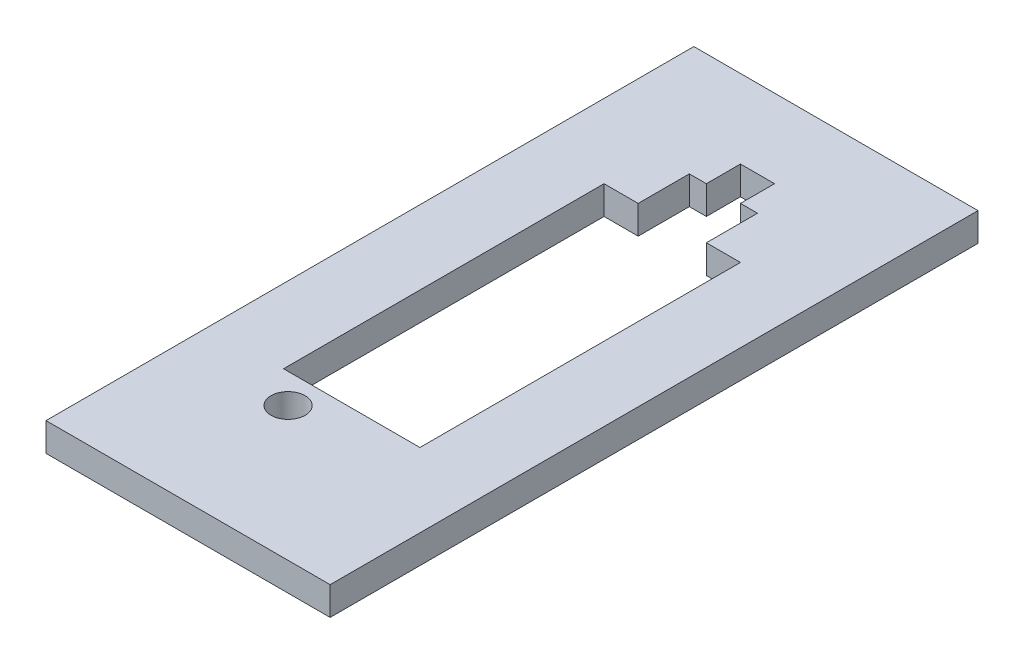
ISO-10303-21;
HEADER;
FILE_DESCRIPTION(('STEP AP214'),'2;1');
FILE_NAME('part.step','',(''),(''),'','','');
FILE_SCHEMA(('AUTOMOTIVE_DESIGN { 1 0 10303 214 1 1 1 1 }'));
ENDSEC;
DATA;
#1=APPLICATION_CONTEXT('core data for automotive mechanical design processes');
#2=APPLICATION_PROTOCOL_DEFINITION('international standard','automotive_design',2000,#1);
#3=PRODUCT_CONTEXT('',#1,'mechanical');
#4=PRODUCT('Part','Part','',(#3));
#5=PRODUCT_RELATED_PRODUCT_CATEGORY('part','',(#4));
#6=PRODUCT_DEFINITION_FORMATION('','',#4);
#7=PRODUCT_DEFINITION_CONTEXT('part definition',#1,'design');
#8=PRODUCT_DEFINITION('design','',#6,#7);
#9=PRODUCT_DEFINITION_SHAPE('','',#8);
#10=(LENGTH_UNIT() NAMED_UNIT(*) SI_UNIT(.MILLI.,.METRE.));
#11=(NAMED_UNIT(*) PLANE_ANGLE_UNIT() SI_UNIT($,.RADIAN.));
#12=(NAMED_UNIT(*) SI_UNIT($,.STERADIAN.) SOLID_ANGLE_UNIT());
#13=UNCERTAINTY_MEASURE_WITH_UNIT(LENGTH_MEASURE(1.E-05),#10,'distance_accuracy_value','');
#14=(GEOMETRIC_REPRESENTATION_CONTEXT(3) GLOBAL_UNCERTAINTY_ASSIGNED_CONTEXT((#13)) GLOBAL_UNIT_ASSIGNED_CONTEXT((#10,
#11,#12)) REPRESENTATION_CONTEXT('',''));
#15=CARTESIAN_POINT('',(0.,0.,0.));
#16=DIRECTION('',(0.,0.,1.));
#17=DIRECTION('',(1.,0.,0.));
#18=AXIS2_PLACEMENT_3D('',#15,#16,#17);
#19=CARTESIAN_POINT('',(-7.62,-38.9217188212443,-17.907));
#20=DIRECTION('',(0.,0.,-1.));
#21=DIRECTION('',(-1.,0.,0.));
#22=AXIS2_PLACEMENT_3D('',#19,#20,#21);
#23=PLANE('',#22);
#24=DIRECTION('',(0.,1.,0.));
#25=VECTOR('',#24,1.);
#26=CARTESIAN_POINT('',(3.81,-12.1979516723096,-17.907));
#27=LINE('',#26,#25);
#28=CARTESIAN_POINT('',(3.81,0.,-17.907));
#29=VERTEX_POINT('',#28);
#30=CARTESIAN_POINT('',(3.81,3.175,-17.907));
#31=VERTEX_POINT('',#30);
#32=EDGE_CURVE('E161',#29,#31,#27,.T.);
#33=ORIENTED_EDGE('',*,*,#32,.F.);
#34=DIRECTION('',(1.,0.,0.));
#35=VECTOR('',#34,1.);
#36=CARTESIAN_POINT('',(-7.62,0.,-17.907));
#37=LINE('',#36,#35);
#38=CARTESIAN_POINT('',(7.62,0.,-17.907));
#39=VERTEX_POINT('',#38);
#40=EDGE_CURVE('E216',#29,#39,#37,.T.);
#41=ORIENTED_EDGE('',*,*,#40,.T.);
#42=DIRECTION('',(0.,1.,0.));
#43=VECTOR('',#42,1.);
#44=CARTESIAN_POINT('',(7.62,-38.9217188212443,-17.907));
#45=LINE('',#44,#43);
#46=CARTESIAN_POINT('',(7.62,3.175,-17.907));
#47=VERTEX_POINT('',#46);
#48=EDGE_CURVE('E227',#39,#47,#45,.T.);
#49=ORIENTED_EDGE('',*,*,#48,.T.);
#50=DIRECTION('',(-1.,0.,0.));
#51=VECTOR('',#50,1.);
#52=CARTESIAN_POINT('',(-7.62,3.175,-17.907));
#53=LINE('',#52,#51);
#54=EDGE_CURVE('E219',#47,#31,#53,.T.);
#55=ORIENTED_EDGE('',*,*,#54,.T.);
#56=EDGE_LOOP('',(#33,#41,#49,#55));
#57=FACE_BOUND('',#56,.T.);
#58=ADVANCED_FACE('F32',(#57),#23,.F.);
#59=CARTESIAN_POINT('',(15.875,3.175,-36.195));
#60=DIRECTION('',(-1.,0.,0.));
#61=DIRECTION('',(0.,0.,1.));
#62=AXIS2_PLACEMENT_3D('',#59,#60,#61);
#63=PLANE('',#62);
#64=DIRECTION('',(0.,0.,-1.));
#65=VECTOR('',#64,1.);
#66=CARTESIAN_POINT('',(15.875,0.,-36.195));
#67=LINE('',#66,#65);
#68=CARTESIAN_POINT('',(15.875,0.,36.195));
#69=VERTEX_POINT('',#68);
#70=CARTESIAN_POINT('',(15.875,0.,-36.195));
#71=VERTEX_POINT('',#70);
#72=EDGE_CURVE('E238',#69,#71,#67,.T.);
#73=ORIENTED_EDGE('',*,*,#72,.T.);
#74=DIRECTION('',(0.,-1.,0.));
#75=VECTOR('',#74,1.);
#76=CARTESIAN_POINT('',(15.875,3.175,-36.195));
#77=LINE('',#76,#75);
#78=CARTESIAN_POINT('',(15.875,3.175,-36.195));
#79=VERTEX_POINT('',#78);
#80=EDGE_CURVE('E11',#79,#71,#77,.T.);
#81=ORIENTED_EDGE('',*,*,#80,.F.);
#82=DIRECTION('',(0.,0.,-1.));
#83=VECTOR('',#82,1.);
#84=CARTESIAN_POINT('',(15.875,3.175,-36.195));
#85=LINE('',#84,#83);
#86=CARTESIAN_POINT('',(15.875,3.175,36.195));
#87=VERTEX_POINT('',#86);
#88=EDGE_CURVE('E239',#87,#79,#85,.T.);
#89=ORIENTED_EDGE('',*,*,#88,.F.);
#90=DIRECTION('',(0.,-1.,0.));
#91=VECTOR('',#90,1.);
#92=CARTESIAN_POINT('',(15.875,3.175,36.195));
#93=LINE('',#92,#91);
#94=EDGE_CURVE('E249',#87,#69,#93,.T.);
#95=ORIENTED_EDGE('',*,*,#94,.T.);
#96=EDGE_LOOP('',(#73,#81,#89,#95));
#97=FACE_BOUND('',#96,.T.);
#98=ADVANCED_FACE('F34',(#97),#63,.F.);
#99=CARTESIAN_POINT('',(-15.875,3.175,-36.195));
#100=DIRECTION('',(0.,0.,1.));
#101=DIRECTION('',(1.,0.,0.));
#102=AXIS2_PLACEMENT_3D('',#99,#100,#101);
#103=PLANE('',#102);
#104=DIRECTION('',(-1.,0.,0.));
#105=VECTOR('',#104,1.);
#106=CARTESIAN_POINT('',(-15.875,0.,-36.195));
#107=LINE('',#106,#105);
#108=CARTESIAN_POINT('',(-15.875,0.,-36.195));
#109=VERTEX_POINT('',#108);
#110=EDGE_CURVE('E252',#71,#109,#107,.T.);
#111=ORIENTED_EDGE('',*,*,#110,.T.);
#112=DIRECTION('',(0.,-1.,0.));
#113=VECTOR('',#112,1.);
#114=CARTESIAN_POINT('',(-15.875,3.175,-36.195));
#115=LINE('',#114,#113);
#116=CARTESIAN_POINT('',(-15.875,3.175,-36.195));
#117=VERTEX_POINT('',#116);
#118=EDGE_CURVE('E40',#117,#109,#115,.T.);
#119=ORIENTED_EDGE('',*,*,#118,.F.);
#120=DIRECTION('',(-1.,0.,0.));
#121=VECTOR('',#120,1.);
#122=CARTESIAN_POINT('',(-15.875,3.175,-36.195));
#123=LINE('',#122,#121);
#124=EDGE_CURVE('E242',#79,#117,#123,.T.);
#125=ORIENTED_EDGE('',*,*,#124,.F.);
#126=ORIENTED_EDGE('',*,*,#80,.T.);
#127=EDGE_LOOP('',(#111,#119,#125,#126));
#128=FACE_BOUND('',#127,.T.);
#129=ADVANCED_FACE('F281',(#128),#103,.F.);
#130=CARTESIAN_POINT('',(-15.875,3.175,-36.195));
#131=DIRECTION('',(1.,0.,0.));
#132=DIRECTION('',(0.,0.,-1.));
#133=AXIS2_PLACEMENT_3D('',#130,#131,#132);
#134=PLANE('',#133);
#135=DIRECTION('',(0.,0.,1.));
#136=VECTOR('',#135,1.);
#137=CARTESIAN_POINT('',(-15.875,0.,-36.195));
#138=LINE('',#137,#136);
#139=CARTESIAN_POINT('',(-15.875,0.,36.195));
#140=VERTEX_POINT('',#139);
#141=EDGE_CURVE('E254',#109,#140,#138,.T.);
#142=ORIENTED_EDGE('',*,*,#141,.T.);
#143=DIRECTION('',(0.,-1.,0.));
#144=VECTOR('',#143,1.);
#145=CARTESIAN_POINT('',(-15.875,3.175,36.195));
#146=LINE('',#145,#144);
#147=CARTESIAN_POINT('',(-15.875,3.175,36.195));
#148=VERTEX_POINT('',#147);
#149=EDGE_CURVE('E259',#148,#140,#146,.T.);
#150=ORIENTED_EDGE('',*,*,#149,.F.);
#151=DIRECTION('',(0.,0.,1.));
#152=VECTOR('',#151,1.);
#153=CARTESIAN_POINT('',(-15.875,3.175,-36.195));
#154=LINE('',#153,#152);
#155=EDGE_CURVE('E245',#117,#148,#154,.T.);
#156=ORIENTED_EDGE('',*,*,#155,.F.);
#157=ORIENTED_EDGE('',*,*,#118,.T.);
#158=EDGE_LOOP('',(#142,#150,#156,#157));
#159=FACE_BOUND('',#158,.T.);
#160=ADVANCED_FACE('F266',(#159),#134,.F.);
#161=CARTESIAN_POINT('',(-15.875,3.175,36.195));
#162=DIRECTION('',(0.,0.,-1.));
#163=DIRECTION('',(-1.,0.,0.));
#164=AXIS2_PLACEMENT_3D('',#161,#162,#163);
#165=PLANE('',#164);
#166=DIRECTION('',(1.,0.,0.));
#167=VECTOR('',#166,1.);
#168=CARTESIAN_POINT('',(-15.875,0.,36.195));
#169=LINE('',#168,#167);
#170=EDGE_CURVE('E243',#140,#69,#169,.T.);
#171=ORIENTED_EDGE('',*,*,#170,.T.);
#172=ORIENTED_EDGE('',*,*,#94,.F.);
#173=DIRECTION('',(1.,0.,0.));
#174=VECTOR('',#173,1.);
#175=CARTESIAN_POINT('',(-15.875,3.175,36.195));
#176=LINE('',#175,#174);
#177=EDGE_CURVE('E247',#148,#87,#176,.T.);
#178=ORIENTED_EDGE('',*,*,#177,.F.);
#179=ORIENTED_EDGE('',*,*,#149,.T.);
#180=EDGE_LOOP('',(#171,#172,#178,#179));
#181=FACE_BOUND('',#180,.T.);
#182=ADVANCED_FACE('F275',(#181),#165,.F.);
#183=CARTESIAN_POINT('',(0.,3.175,0.));
#184=DIRECTION('',(0.,1.,0.));
#185=DIRECTION('',(0.,0.,1.));
#186=AXIS2_PLACEMENT_3D('',#183,#184,#185);
#187=PLANE('',#186);
#188=DIRECTION('',(0.,0.,1.));
#189=VECTOR('',#188,1.);
#190=CARTESIAN_POINT('',(-3.81,3.175,0.));
#191=LINE('',#190,#189);
#192=CARTESIAN_POINT('',(-3.81,3.175,-23.622));
#193=VERTEX_POINT('',#192);
#194=CARTESIAN_POINT('',(-3.81,3.175,-17.907));
#195=VERTEX_POINT('',#194);
#196=EDGE_CURVE('E156',#193,#195,#191,.T.);
#197=ORIENTED_EDGE('',*,*,#196,.F.);
#198=DIRECTION('',(1.,0.,0.));
#199=VECTOR('',#198,1.);
#200=CARTESIAN_POINT('',(0.,3.175,-23.622));
#201=LINE('',#200,#199);
#202=CARTESIAN_POINT('',(-1.905,3.175,-23.622));
#203=VERTEX_POINT('',#202);
#204=EDGE_CURVE('E174',#193,#203,#201,.T.);
#205=ORIENTED_EDGE('',*,*,#204,.T.);
#206=DIRECTION('',(0.,0.,1.));
#207=VECTOR('',#206,1.);
#208=CARTESIAN_POINT('',(-1.90499999999999,3.175,0.));
#209=LINE('',#208,#207);
#210=CARTESIAN_POINT('',(-1.905,3.175,-27.432));
#211=VERTEX_POINT('',#210);
#212=EDGE_CURVE('E178',#211,#203,#209,.T.);
#213=ORIENTED_EDGE('',*,*,#212,.F.);
#214=DIRECTION('',(1.,0.,0.));
#215=VECTOR('',#214,1.);
#216=CARTESIAN_POINT('',(0.,3.175,-27.432));
#217=LINE('',#216,#215);
#218=CARTESIAN_POINT('',(1.905,3.175,-27.432));
#219=VERTEX_POINT('',#218);
#220=EDGE_CURVE('E175',#211,#219,#217,.T.);
#221=ORIENTED_EDGE('',*,*,#220,.T.);
#222=DIRECTION('',(0.,0.,1.));
#223=VECTOR('',#222,1.);
#224=CARTESIAN_POINT('',(1.905,3.175,0.));
#225=LINE('',#224,#223);
#226=CARTESIAN_POINT('',(1.905,3.175,-23.622));
#227=VERTEX_POINT('',#226);
#228=EDGE_CURVE('E172',#219,#227,#225,.T.);
#229=ORIENTED_EDGE('',*,*,#228,.T.);
#230=CARTESIAN_POINT('',(3.81,3.175,-23.622));
#231=VERTEX_POINT('',#230);
#232=EDGE_CURVE('E151',#227,#231,#201,.T.);
#233=ORIENTED_EDGE('',*,*,#232,.T.);
#234=DIRECTION('',(0.,0.,1.));
#235=VECTOR('',#234,1.);
#236=CARTESIAN_POINT('',(3.81,3.175,0.));
#237=LINE('',#236,#235);
#238=EDGE_CURVE('E159',#231,#31,#237,.T.);
#239=ORIENTED_EDGE('',*,*,#238,.T.);
#240=ORIENTED_EDGE('',*,*,#54,.F.);
#241=DIRECTION('',(0.,0.,-1.));
#242=VECTOR('',#241,1.);
#243=CARTESIAN_POINT('',(7.62,3.175,-17.907));
#244=LINE('',#243,#242);
#245=CARTESIAN_POINT('',(7.62,3.175,17.907));
#246=VERTEX_POINT('',#245);
#247=EDGE_CURVE('E55',#246,#47,#244,.T.);
#248=ORIENTED_EDGE('',*,*,#247,.F.);
#249=DIRECTION('',(1.,0.,0.));
#250=VECTOR('',#249,1.);
#251=CARTESIAN_POINT('',(-7.62,3.175,17.907));
#252=LINE('',#251,#250);
#253=CARTESIAN_POINT('',(-7.62,3.175,17.907));
#254=VERTEX_POINT('',#253);
#255=EDGE_CURVE('E224',#254,#246,#252,.T.);
#256=ORIENTED_EDGE('',*,*,#255,.F.);
#257=DIRECTION('',(0.,0.,1.));
#258=VECTOR('',#257,1.);
#259=CARTESIAN_POINT('',(-7.62,3.175,-17.907));
#260=LINE('',#259,#258);
#261=CARTESIAN_POINT('',(-7.62,3.175,-17.907));
#262=VERTEX_POINT('',#261);
#263=EDGE_CURVE('E221',#262,#254,#260,.T.);
#264=ORIENTED_EDGE('',*,*,#263,.F.);
#265=EDGE_CURVE('E218',#195,#262,#53,.T.);
#266=ORIENTED_EDGE('',*,*,#265,.F.);
#267=EDGE_LOOP('',(#197,#205,#213,#221,#229,#233,#239,#240,#248,#256,#264,#266));
#268=FACE_BOUND('',#267,.T.);
#269=CARTESIAN_POINT('',(-3.81,3.175,21.209));
#270=DIRECTION('',(0.,1.,0.));
#271=DIRECTION('',(0.,0.,1.));
#272=AXIS2_PLACEMENT_3D('',#269,#270,#271);
#273=CIRCLE('',#272,1.905);
#274=CARTESIAN_POINT('',(-3.81,3.175,23.114));
#275=VERTEX_POINT('',#274);
#276=EDGE_CURVE('E203',#275,#275,#273,.T.);
#277=ORIENTED_EDGE('',*,*,#276,.F.);
#278=EDGE_LOOP('',(#277));
#279=FACE_BOUND('',#278,.T.);
#280=ORIENTED_EDGE('',*,*,#88,.T.);
#281=ORIENTED_EDGE('',*,*,#124,.T.);
#282=ORIENTED_EDGE('',*,*,#155,.T.);
#283=ORIENTED_EDGE('',*,*,#177,.T.);
#284=EDGE_LOOP('',(#280,#281,#282,#283));
#285=FACE_BOUND('',#284,.T.);
#286=ADVANCED_FACE('F168',(#268,#279,#285),#187,.T.);
#287=CARTESIAN_POINT('',(0.,0.,0.));
#288=DIRECTION('',(0.,1.,0.));
#289=DIRECTION('',(0.,0.,1.));
#290=AXIS2_PLACEMENT_3D('',#287,#288,#289);
#291=PLANE('',#290);
#292=CARTESIAN_POINT('',(-3.81,0.,21.209));
#293=DIRECTION('',(0.,1.,0.));
#294=DIRECTION('',(0.,0.,1.));
#295=AXIS2_PLACEMENT_3D('',#292,#293,#294);
#296=CIRCLE('',#295,1.905);
#297=CARTESIAN_POINT('',(-3.81,0.,23.114));
#298=VERTEX_POINT('',#297);
#299=EDGE_CURVE('E165',#298,#298,#296,.F.);
#300=ORIENTED_EDGE('',*,*,#299,.F.);
#301=EDGE_LOOP('',(#300));
#302=FACE_BOUND('',#301,.T.);
#303=DIRECTION('',(-1.,0.,0.));
#304=VECTOR('',#303,1.);
#305=CARTESIAN_POINT('',(0.,0.,-23.622));
#306=LINE('',#305,#304);
#307=CARTESIAN_POINT('',(-1.905,0.,-23.622));
#308=VERTEX_POINT('',#307);
#309=CARTESIAN_POINT('',(-3.81,0.,-23.622));
#310=VERTEX_POINT('',#309);
#311=EDGE_CURVE('E317',#308,#310,#306,.T.);
#312=ORIENTED_EDGE('',*,*,#311,.T.);
#313=DIRECTION('',(0.,0.,-1.));
#314=VECTOR('',#313,1.);
#315=CARTESIAN_POINT('',(-3.81,0.,0.));
#316=LINE('',#315,#314);
#317=CARTESIAN_POINT('',(-3.81,0.,-17.907));
#318=VERTEX_POINT('',#317);
#319=EDGE_CURVE('E315',#318,#310,#316,.T.);
#320=ORIENTED_EDGE('',*,*,#319,.F.);
#321=CARTESIAN_POINT('',(-7.62,0.,-17.907));
#322=VERTEX_POINT('',#321);
#323=EDGE_CURVE('E235',#322,#318,#37,.T.);
#324=ORIENTED_EDGE('',*,*,#323,.F.);
#325=DIRECTION('',(0.,0.,-1.));
#326=VECTOR('',#325,1.);
#327=CARTESIAN_POINT('',(-7.62,0.,-17.907));
#328=LINE('',#327,#326);
#329=CARTESIAN_POINT('',(-7.62,0.,17.907));
#330=VERTEX_POINT('',#329);
#331=EDGE_CURVE('E208',#330,#322,#328,.T.);
#332=ORIENTED_EDGE('',*,*,#331,.F.);
#333=DIRECTION('',(-1.,0.,0.));
#334=VECTOR('',#333,1.);
#335=CARTESIAN_POINT('',(-7.62,0.,17.907));
#336=LINE('',#335,#334);
#337=CARTESIAN_POINT('',(7.62,0.,17.907));
#338=VERTEX_POINT('',#337);
#339=EDGE_CURVE('E211',#338,#330,#336,.T.);
#340=ORIENTED_EDGE('',*,*,#339,.F.);
#341=DIRECTION('',(0.,0.,1.));
#342=VECTOR('',#341,1.);
#343=CARTESIAN_POINT('',(7.62,0.,-17.907));
#344=LINE('',#343,#342);
#345=EDGE_CURVE('E214',#39,#338,#344,.T.);
#346=ORIENTED_EDGE('',*,*,#345,.F.);
#347=ORIENTED_EDGE('',*,*,#40,.F.);
#348=DIRECTION('',(0.,0.,-1.));
#349=VECTOR('',#348,1.);
#350=CARTESIAN_POINT('',(3.81,0.,0.));
#351=LINE('',#350,#349);
#352=CARTESIAN_POINT('',(3.81,0.,-23.622));
#353=VERTEX_POINT('',#352);
#354=EDGE_CURVE('E47',#29,#353,#351,.T.);
#355=ORIENTED_EDGE('',*,*,#354,.T.);
#356=DIRECTION('',(-1.,0.,0.));
#357=VECTOR('',#356,1.);
#358=CARTESIAN_POINT('',(0.,0.,-23.622));
#359=LINE('',#358,#357);
#360=CARTESIAN_POINT('',(1.905,0.,-23.622));
#361=VERTEX_POINT('',#360);
#362=EDGE_CURVE('E154',#353,#361,#359,.T.);
#363=ORIENTED_EDGE('',*,*,#362,.T.);
#364=DIRECTION('',(0.,0.,-1.));
#365=VECTOR('',#364,1.);
#366=CARTESIAN_POINT('',(1.905,0.,0.));
#367=LINE('',#366,#365);
#368=CARTESIAN_POINT('',(1.905,0.,-27.432));
#369=VERTEX_POINT('',#368);
#370=EDGE_CURVE('E202',#361,#369,#367,.T.);
#371=ORIENTED_EDGE('',*,*,#370,.T.);
#372=DIRECTION('',(-1.,0.,0.));
#373=VECTOR('',#372,1.);
#374=CARTESIAN_POINT('',(0.,0.,-27.432));
#375=LINE('',#374,#373);
#376=CARTESIAN_POINT('',(-1.905,0.,-27.432));
#377=VERTEX_POINT('',#376);
#378=EDGE_CURVE('E326',#369,#377,#375,.T.);
#379=ORIENTED_EDGE('',*,*,#378,.T.);
#380=DIRECTION('',(0.,0.,-1.));
#381=VECTOR('',#380,1.);
#382=CARTESIAN_POINT('',(-1.90499999999999,0.,0.));
#383=LINE('',#382,#381);
#384=EDGE_CURVE('E322',#308,#377,#383,.T.);
#385=ORIENTED_EDGE('',*,*,#384,.F.);
#386=EDGE_LOOP('',(#312,#320,#324,#332,#340,#346,#347,#355,#363,#371,#379,#385));
#387=FACE_BOUND('',#386,.T.);
#388=ORIENTED_EDGE('',*,*,#72,.F.);
#389=ORIENTED_EDGE('',*,*,#170,.F.);
#390=ORIENTED_EDGE('',*,*,#141,.F.);
#391=ORIENTED_EDGE('',*,*,#110,.F.);
#392=EDGE_LOOP('',(#388,#389,#390,#391));
#393=FACE_BOUND('',#392,.T.);
#394=ADVANCED_FACE('F272',(#302,#387,#393),#291,.F.);
#395=CARTESIAN_POINT('',(7.62,-38.9217188212443,-17.907));
#396=DIRECTION('',(1.,0.,0.));
#397=DIRECTION('',(0.,0.,-1.));
#398=AXIS2_PLACEMENT_3D('',#395,#396,#397);
#399=PLANE('',#398);
#400=ORIENTED_EDGE('',*,*,#345,.T.);
#401=DIRECTION('',(0.,1.,0.));
#402=VECTOR('',#401,1.);
#403=CARTESIAN_POINT('',(7.62,-38.9217188212443,17.907));
#404=LINE('',#403,#402);
#405=EDGE_CURVE('E212',#338,#246,#404,.T.);
#406=ORIENTED_EDGE('',*,*,#405,.T.);
#407=ORIENTED_EDGE('',*,*,#247,.T.);
#408=ORIENTED_EDGE('',*,*,#48,.F.);
#409=EDGE_LOOP('',(#400,#406,#407,#408));
#410=FACE_BOUND('',#409,.T.);
#411=ADVANCED_FACE('F346',(#410),#399,.F.);
#412=CARTESIAN_POINT('',(-7.62,-38.9217188212443,17.907));
#413=DIRECTION('',(0.,0.,1.));
#414=DIRECTION('',(1.,0.,0.));
#415=AXIS2_PLACEMENT_3D('',#412,#413,#414);
#416=PLANE('',#415);
#417=ORIENTED_EDGE('',*,*,#339,.T.);
#418=DIRECTION('',(0.,1.,0.));
#419=VECTOR('',#418,1.);
#420=CARTESIAN_POINT('',(-7.62,-38.9217188212443,17.907));
#421=LINE('',#420,#419);
#422=EDGE_CURVE('E229',#330,#254,#421,.T.);
#423=ORIENTED_EDGE('',*,*,#422,.T.);
#424=ORIENTED_EDGE('',*,*,#255,.T.);
#425=ORIENTED_EDGE('',*,*,#405,.F.);
#426=EDGE_LOOP('',(#417,#423,#424,#425));
#427=FACE_BOUND('',#426,.T.);
#428=ADVANCED_FACE('F306',(#427),#416,.F.);
#429=CARTESIAN_POINT('',(-7.62,-38.9217188212443,-17.907));
#430=DIRECTION('',(-1.,0.,0.));
#431=DIRECTION('',(0.,0.,1.));
#432=AXIS2_PLACEMENT_3D('',#429,#430,#431);
#433=PLANE('',#432);
#434=ORIENTED_EDGE('',*,*,#331,.T.);
#435=DIRECTION('',(0.,1.,0.));
#436=VECTOR('',#435,1.);
#437=CARTESIAN_POINT('',(-7.62,-38.9217188212443,-17.907));
#438=LINE('',#437,#436);
#439=EDGE_CURVE('E231',#322,#262,#438,.T.);
#440=ORIENTED_EDGE('',*,*,#439,.T.);
#441=ORIENTED_EDGE('',*,*,#263,.T.);
#442=ORIENTED_EDGE('',*,*,#422,.F.);
#443=EDGE_LOOP('',(#434,#440,#441,#442));
#444=FACE_BOUND('',#443,.T.);
#445=ADVANCED_FACE('F297',(#444),#433,.F.);
#446=ORIENTED_EDGE('',*,*,#323,.T.);
#447=DIRECTION('',(0.,1.,0.));
#448=VECTOR('',#447,1.);
#449=CARTESIAN_POINT('',(-3.81,-12.1979516723096,-17.907));
#450=LINE('',#449,#448);
#451=EDGE_CURVE('E189',#318,#195,#450,.T.);
#452=ORIENTED_EDGE('',*,*,#451,.T.);
#453=ORIENTED_EDGE('',*,*,#265,.T.);
#454=ORIENTED_EDGE('',*,*,#439,.F.);
#455=EDGE_LOOP('',(#446,#452,#453,#454));
#456=FACE_BOUND('',#455,.T.);
#457=ADVANCED_FACE('F291',(#456),#23,.F.);
#458=CARTESIAN_POINT('',(0.,-12.1979516723096,-23.622));
#459=DIRECTION('',(0.,0.,1.));
#460=DIRECTION('',(1.,0.,0.));
#461=AXIS2_PLACEMENT_3D('',#458,#459,#460);
#462=PLANE('',#461);
#463=DIRECTION('',(0.,1.,0.));
#464=VECTOR('',#463,1.);
#465=CARTESIAN_POINT('',(3.81,-12.1979516723096,-23.622));
#466=LINE('',#465,#464);
#467=EDGE_CURVE('E146',#353,#231,#466,.T.);
#468=ORIENTED_EDGE('',*,*,#467,.T.);
#469=ORIENTED_EDGE('',*,*,#232,.F.);
#470=DIRECTION('',(0.,1.,0.));
#471=VECTOR('',#470,1.);
#472=CARTESIAN_POINT('',(1.905,-12.1979516723096,-23.622));
#473=LINE('',#472,#471);
#474=EDGE_CURVE('E155',#361,#227,#473,.T.);
#475=ORIENTED_EDGE('',*,*,#474,.F.);
#476=ORIENTED_EDGE('',*,*,#362,.F.);
#477=EDGE_LOOP('',(#468,#469,#475,#476));
#478=FACE_BOUND('',#477,.T.);
#479=ADVANCED_FACE('F148',(#478),#462,.T.);
#480=CARTESIAN_POINT('',(1.905,-12.1979516723096,0.));
#481=DIRECTION('',(-1.,0.,0.));
#482=DIRECTION('',(0.,0.,1.));
#483=AXIS2_PLACEMENT_3D('',#480,#481,#482);
#484=PLANE('',#483);
#485=ORIENTED_EDGE('',*,*,#474,.T.);
#486=ORIENTED_EDGE('',*,*,#228,.F.);
#487=DIRECTION('',(0.,1.,0.));
#488=VECTOR('',#487,1.);
#489=CARTESIAN_POINT('',(1.905,-12.1979516723096,-27.432));
#490=LINE('',#489,#488);
#491=EDGE_CURVE('E198',#369,#219,#490,.T.);
#492=ORIENTED_EDGE('',*,*,#491,.F.);
#493=ORIENTED_EDGE('',*,*,#370,.F.);
#494=EDGE_LOOP('',(#485,#486,#492,#493));
#495=FACE_BOUND('',#494,.T.);
#496=ADVANCED_FACE('F303',(#495),#484,.T.);
#497=CARTESIAN_POINT('',(0.,-12.1979516723096,-27.432));
#498=DIRECTION('',(0.,0.,1.));
#499=DIRECTION('',(1.,0.,0.));
#500=AXIS2_PLACEMENT_3D('',#497,#498,#499);
#501=PLANE('',#500);
#502=ORIENTED_EDGE('',*,*,#491,.T.);
#503=ORIENTED_EDGE('',*,*,#220,.F.);
#504=DIRECTION('',(0.,1.,0.));
#505=VECTOR('',#504,1.);
#506=CARTESIAN_POINT('',(-1.905,-12.1979516723096,-27.432));
#507=LINE('',#506,#505);
#508=EDGE_CURVE('E196',#377,#211,#507,.T.);
#509=ORIENTED_EDGE('',*,*,#508,.F.);
#510=ORIENTED_EDGE('',*,*,#378,.F.);
#511=EDGE_LOOP('',(#502,#503,#509,#510));
#512=FACE_BOUND('',#511,.T.);
#513=ADVANCED_FACE('F334',(#512),#501,.T.);
#514=CARTESIAN_POINT('',(-1.90499999999999,-12.1979516723096,0.));
#515=DIRECTION('',(-1.,0.,0.));
#516=DIRECTION('',(0.,0.,1.));
#517=AXIS2_PLACEMENT_3D('',#514,#515,#516);
#518=PLANE('',#517);
#519=ORIENTED_EDGE('',*,*,#384,.T.);
#520=ORIENTED_EDGE('',*,*,#508,.T.);
#521=ORIENTED_EDGE('',*,*,#212,.T.);
#522=DIRECTION('',(0.,1.,0.));
#523=VECTOR('',#522,1.);
#524=CARTESIAN_POINT('',(-1.905,-12.1979516723096,-23.622));
#525=LINE('',#524,#523);
#526=EDGE_CURVE('E194',#308,#203,#525,.T.);
#527=ORIENTED_EDGE('',*,*,#526,.F.);
#528=EDGE_LOOP('',(#519,#520,#521,#527));
#529=FACE_BOUND('',#528,.T.);
#530=ADVANCED_FACE('F336',(#529),#518,.F.);
#531=ORIENTED_EDGE('',*,*,#526,.T.);
#532=ORIENTED_EDGE('',*,*,#204,.F.);
#533=DIRECTION('',(0.,1.,0.));
#534=VECTOR('',#533,1.);
#535=CARTESIAN_POINT('',(-3.81,-12.1979516723096,-23.622));
#536=LINE('',#535,#534);
#537=EDGE_CURVE('E192',#310,#193,#536,.T.);
#538=ORIENTED_EDGE('',*,*,#537,.F.);
#539=ORIENTED_EDGE('',*,*,#311,.F.);
#540=EDGE_LOOP('',(#531,#532,#538,#539));
#541=FACE_BOUND('',#540,.T.);
#542=ADVANCED_FACE('F305',(#541),#462,.T.);
#543=CARTESIAN_POINT('',(-3.81,-12.1979516723096,0.));
#544=DIRECTION('',(-1.,0.,0.));
#545=DIRECTION('',(0.,0.,1.));
#546=AXIS2_PLACEMENT_3D('',#543,#544,#545);
#547=PLANE('',#546);
#548=ORIENTED_EDGE('',*,*,#319,.T.);
#549=ORIENTED_EDGE('',*,*,#537,.T.);
#550=ORIENTED_EDGE('',*,*,#196,.T.);
#551=ORIENTED_EDGE('',*,*,#451,.F.);
#552=EDGE_LOOP('',(#548,#549,#550,#551));
#553=FACE_BOUND('',#552,.T.);
#554=ADVANCED_FACE('F338',(#553),#547,.F.);
#555=CARTESIAN_POINT('',(3.81,-12.1979516723096,0.));
#556=DIRECTION('',(-1.,0.,0.));
#557=DIRECTION('',(0.,0.,1.));
#558=AXIS2_PLACEMENT_3D('',#555,#556,#557);
#559=PLANE('',#558);
#560=ORIENTED_EDGE('',*,*,#32,.T.);
#561=ORIENTED_EDGE('',*,*,#238,.F.);
#562=ORIENTED_EDGE('',*,*,#467,.F.);
#563=ORIENTED_EDGE('',*,*,#354,.F.);
#564=EDGE_LOOP('',(#560,#561,#562,#563));
#565=FACE_BOUND('',#564,.T.);
#566=ADVANCED_FACE('F160',(#565),#559,.T.);
#567=CARTESIAN_POINT('',(-3.81,-12.1979516723096,21.209));
#568=DIRECTION('',(0.,1.,0.));
#569=DIRECTION('',(0.,0.,1.));
#570=AXIS2_PLACEMENT_3D('',#567,#568,#569);
#571=CYLINDRICAL_SURFACE('',#570,1.905);
#572=ORIENTED_EDGE('',*,*,#299,.T.);
#573=EDGE_LOOP('',(#572));
#574=FACE_BOUND('',#573,.T.);
#575=ORIENTED_EDGE('',*,*,#276,.T.);
#576=EDGE_LOOP('',(#575));
#577=FACE_BOUND('',#576,.T.);
#578=ADVANCED_FACE('F434',(#574,#577),#571,.F.);
#579=CLOSED_SHELL('',(#58,#98,#129,#160,#182,#286,#394,#411,#428,#445,#457,#479,#496,#513,#530,
#542,#554,#566,#578));
#580=MANIFOLD_SOLID_BREP('B2',#579);
#581=ADVANCED_BREP_SHAPE_REPRESENTATION('',(#18,#580),#14);
#582=SHAPE_DEFINITION_REPRESENTATION(#9,#581);
ENDSEC;
END-ISO-10303-21;
